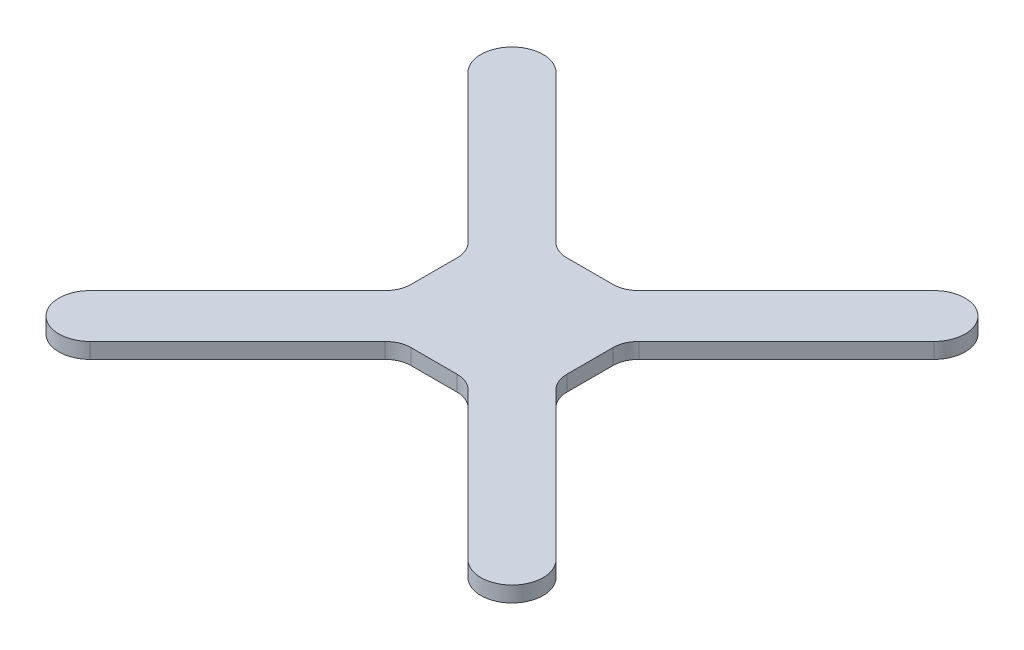
ISO-10303-21;
HEADER;
FILE_DESCRIPTION(('STEP AP214'),'2;1');
FILE_NAME('part.step','',(''),(''),'','','');
FILE_SCHEMA(('AUTOMOTIVE_DESIGN { 1 0 10303 214 1 1 1 1 }'));
ENDSEC;
DATA;
#1=APPLICATION_CONTEXT('core data for automotive mechanical design processes');
#2=APPLICATION_PROTOCOL_DEFINITION('international standard','automotive_design',2000,#1);
#3=PRODUCT_CONTEXT('',#1,'mechanical');
#4=PRODUCT('Part','Part','',(#3));
#5=PRODUCT_RELATED_PRODUCT_CATEGORY('part','',(#4));
#6=PRODUCT_DEFINITION_FORMATION('','',#4);
#7=PRODUCT_DEFINITION_CONTEXT('part definition',#1,'design');
#8=PRODUCT_DEFINITION('design','',#6,#7);
#9=PRODUCT_DEFINITION_SHAPE('','',#8);
#10=(LENGTH_UNIT() NAMED_UNIT(*) SI_UNIT(.MILLI.,.METRE.));
#11=(NAMED_UNIT(*) PLANE_ANGLE_UNIT() SI_UNIT($,.RADIAN.));
#12=(NAMED_UNIT(*) SI_UNIT($,.STERADIAN.) SOLID_ANGLE_UNIT());
#13=UNCERTAINTY_MEASURE_WITH_UNIT(LENGTH_MEASURE(1.E-05),#10,'distance_accuracy_value','');
#14=(GEOMETRIC_REPRESENTATION_CONTEXT(3) GLOBAL_UNCERTAINTY_ASSIGNED_CONTEXT((#13)) GLOBAL_UNIT_ASSIGNED_CONTEXT((#10,
#11,#12)) REPRESENTATION_CONTEXT('',''));
#15=CARTESIAN_POINT('',(0.,0.,0.));
#16=DIRECTION('',(0.,0.,1.));
#17=DIRECTION('',(1.,0.,0.));
#18=AXIS2_PLACEMENT_3D('',#15,#16,#17);
#19=CARTESIAN_POINT('',(-81.317279836453,6.,-81.317279836453));
#20=DIRECTION('',(0.,-1.,0.));
#21=DIRECTION('',(0.,0.,-1.));
#22=AXIS2_PLACEMENT_3D('',#19,#20,#21);
#23=CYLINDRICAL_SURFACE('',#22,12.0000000000002);
#24=CARTESIAN_POINT('',(-81.317279836453,0.,-81.317279836453));
#25=DIRECTION('',(0.,1.,0.));
#26=DIRECTION('',(0.,0.,1.));
#27=AXIS2_PLACEMENT_3D('',#24,#25,#26);
#28=CIRCLE('',#27,12.0000000000002);
#29=CARTESIAN_POINT('',(-72.8319984622141,0.,-89.8025612106918));
#30=VERTEX_POINT('',#29);
#31=CARTESIAN_POINT('',(-89.8025612106915,0.,-72.8319984622144));
#32=VERTEX_POINT('',#31);
#33=EDGE_CURVE('E231',#30,#32,#28,.T.);
#34=ORIENTED_EDGE('',*,*,#33,.T.);
#35=DIRECTION('',(0.,-1.,0.));
#36=VECTOR('',#35,1.);
#37=CARTESIAN_POINT('',(-89.8025612106915,6.,-72.8319984622144));
#38=LINE('',#37,#36);
#39=CARTESIAN_POINT('',(-89.8025612106915,6.,-72.8319984622144));
#40=VERTEX_POINT('',#39);
#41=EDGE_CURVE('E210',#40,#32,#38,.T.);
#42=ORIENTED_EDGE('',*,*,#41,.F.);
#43=CARTESIAN_POINT('',(-81.317279836453,6.,-81.317279836453));
#44=DIRECTION('',(0.,1.,0.));
#45=DIRECTION('',(0.,0.,1.));
#46=AXIS2_PLACEMENT_3D('',#43,#44,#45);
#47=CIRCLE('',#46,12.0000000000002);
#48=CARTESIAN_POINT('',(-72.8319984622141,6.,-89.8025612106918));
#49=VERTEX_POINT('',#48);
#50=EDGE_CURVE('E218',#49,#40,#47,.T.);
#51=ORIENTED_EDGE('',*,*,#50,.F.);
#52=DIRECTION('',(0.,-1.,0.));
#53=VECTOR('',#52,1.);
#54=CARTESIAN_POINT('',(-72.8319984622141,6.,-89.8025612106918));
#55=LINE('',#54,#53);
#56=EDGE_CURVE('E402',#49,#30,#55,.T.);
#57=ORIENTED_EDGE('',*,*,#56,.T.);
#58=EDGE_LOOP('',(#34,#42,#51,#57));
#59=FACE_BOUND('',#58,.T.);
#60=ADVANCED_FACE('F43',(#59),#23,.T.);
#61=CARTESIAN_POINT('',(-89.8025612106915,6.,-72.8319984622144));
#62=DIRECTION('',(0.707106781186549,0.,-0.707106781186546));
#63=DIRECTION('',(-0.707106781186546,0.,-0.707106781186549));
#64=AXIS2_PLACEMENT_3D('',#61,#62,#63);
#65=PLANE('',#64);
#66=DIRECTION('',(0.707106781186546,0.,0.707106781186549));
#67=VECTOR('',#66,1.);
#68=CARTESIAN_POINT('',(-89.8025612106915,0.,-72.8319984622144));
#69=LINE('',#68,#67);
#70=CARTESIAN_POINT('',(-32.928932188135,0.,-15.9583694396576));
#71=VERTEX_POINT('',#70);
#72=EDGE_CURVE('E436',#32,#71,#69,.T.);
#73=ORIENTED_EDGE('',*,*,#72,.T.);
#74=DIRECTION('',(0.,-1.,0.));
#75=VECTOR('',#74,1.);
#76=CARTESIAN_POINT('',(-32.928932188135,6.,-15.9583694396576));
#77=LINE('',#76,#75);
#78=CARTESIAN_POINT('',(-32.928932188135,6.,-15.9583694396576));
#79=VERTEX_POINT('',#78);
#80=EDGE_CURVE('E213',#71,#79,#77,.F.);
#81=ORIENTED_EDGE('',*,*,#80,.T.);
#82=DIRECTION('',(0.707106781186546,0.,0.707106781186549));
#83=VECTOR('',#82,1.);
#84=CARTESIAN_POINT('',(-89.8025612106915,6.,-72.8319984622144));
#85=LINE('',#84,#83);
#86=EDGE_CURVE('E205',#40,#79,#85,.T.);
#87=ORIENTED_EDGE('',*,*,#86,.F.);
#88=ORIENTED_EDGE('',*,*,#41,.T.);
#89=EDGE_LOOP('',(#73,#81,#87,#88));
#90=FACE_BOUND('',#89,.T.);
#91=ADVANCED_FACE('F208',(#90),#65,.F.);
#92=CARTESIAN_POINT('',(-30.0000000000005,6.,13.0294372515225));
#93=DIRECTION('',(1.,0.,0.));
#94=DIRECTION('',(0.,0.,-1.));
#95=AXIS2_PLACEMENT_3D('',#92,#93,#94);
#96=PLANE('',#95);
#97=DIRECTION('',(0.,0.,1.));
#98=VECTOR('',#97,1.);
#99=CARTESIAN_POINT('',(-30.0000000000005,6.,13.0294372515225));
#100=LINE('',#99,#98);
#101=CARTESIAN_POINT('',(-30.0000000000005,6.,-8.88730162779214));
#102=VERTEX_POINT('',#101);
#103=CARTESIAN_POINT('',(-30.0000000000005,6.,8.88730162779154));
#104=VERTEX_POINT('',#103);
#105=EDGE_CURVE('E217',#102,#104,#100,.T.);
#106=ORIENTED_EDGE('',*,*,#105,.F.);
#107=DIRECTION('',(0.,-1.,0.));
#108=VECTOR('',#107,1.);
#109=CARTESIAN_POINT('',(-30.0000000000005,0.,-8.88730162779215));
#110=LINE('',#109,#108);
#111=CARTESIAN_POINT('',(-30.0000000000005,0.,-8.88730162779214));
#112=VERTEX_POINT('',#111);
#113=EDGE_CURVE('E238',#102,#112,#110,.T.);
#114=ORIENTED_EDGE('',*,*,#113,.T.);
#115=DIRECTION('',(0.,0.,1.));
#116=VECTOR('',#115,1.);
#117=CARTESIAN_POINT('',(-30.0000000000005,0.,13.0294372515225));
#118=LINE('',#117,#116);
#119=CARTESIAN_POINT('',(-30.0000000000005,0.,8.88730162779154));
#120=VERTEX_POINT('',#119);
#121=EDGE_CURVE('E430',#112,#120,#118,.T.);
#122=ORIENTED_EDGE('',*,*,#121,.T.);
#123=DIRECTION('',(0.,-1.,0.));
#124=VECTOR('',#123,1.);
#125=CARTESIAN_POINT('',(-30.0000000000005,6.,8.88730162779154));
#126=LINE('',#125,#124);
#127=EDGE_CURVE('E233',#120,#104,#126,.F.);
#128=ORIENTED_EDGE('',*,*,#127,.T.);
#129=EDGE_LOOP('',(#106,#114,#122,#128));
#130=FACE_BOUND('',#129,.T.);
#131=ADVANCED_FACE('F500',(#130),#96,.F.);
#132=CARTESIAN_POINT('',(-30.0000000000005,6.,13.0294372515225));
#133=DIRECTION('',(0.707106781186553,0.,0.707106781186542));
#134=DIRECTION('',(0.707106781186542,0.,-0.707106781186553));
#135=AXIS2_PLACEMENT_3D('',#132,#133,#134);
#136=PLANE('',#135);
#137=DIRECTION('',(-0.707106781186542,0.,0.707106781186553));
#138=VECTOR('',#137,1.);
#139=CARTESIAN_POINT('',(-30.0000000000005,6.,13.0294372515225));
#140=LINE('',#139,#138);
#141=CARTESIAN_POINT('',(-32.9289321881349,6.,15.958369439657));
#142=VERTEX_POINT('',#141);
#143=CARTESIAN_POINT('',(-89.8025612106917,6.,72.8319984622141));
#144=VERTEX_POINT('',#143);
#145=EDGE_CURVE('E474',#142,#144,#140,.T.);
#146=ORIENTED_EDGE('',*,*,#145,.F.);
#147=DIRECTION('',(0.,-1.,0.));
#148=VECTOR('',#147,1.);
#149=CARTESIAN_POINT('',(-32.9289321881349,0.,15.958369439657));
#150=LINE('',#149,#148);
#151=CARTESIAN_POINT('',(-32.9289321881349,0.,15.958369439657));
#152=VERTEX_POINT('',#151);
#153=EDGE_CURVE('E250',#142,#152,#150,.T.);
#154=ORIENTED_EDGE('',*,*,#153,.T.);
#155=DIRECTION('',(-0.707106781186542,0.,0.707106781186553));
#156=VECTOR('',#155,1.);
#157=CARTESIAN_POINT('',(-30.0000000000005,0.,13.0294372515225));
#158=LINE('',#157,#156);
#159=CARTESIAN_POINT('',(-89.8025612106917,0.,72.8319984622141));
#160=VERTEX_POINT('',#159);
#161=EDGE_CURVE('E427',#152,#160,#158,.T.);
#162=ORIENTED_EDGE('',*,*,#161,.T.);
#163=DIRECTION('',(0.,-1.,0.));
#164=VECTOR('',#163,1.);
#165=CARTESIAN_POINT('',(-89.8025612106917,6.,72.8319984622141));
#166=LINE('',#165,#164);
#167=EDGE_CURVE('E234',#144,#160,#166,.T.);
#168=ORIENTED_EDGE('',*,*,#167,.F.);
#169=EDGE_LOOP('',(#146,#154,#162,#168));
#170=FACE_BOUND('',#169,.T.);
#171=ADVANCED_FACE('F489',(#170),#136,.F.);
#172=CARTESIAN_POINT('',(-81.317279836453,6.,81.3172798364529));
#173=DIRECTION('',(0.,-1.,0.));
#174=DIRECTION('',(0.,0.,-1.));
#175=AXIS2_PLACEMENT_3D('',#172,#173,#174);
#176=CYLINDRICAL_SURFACE('',#175,12.0000000000003);
#177=CARTESIAN_POINT('',(-81.317279836453,0.,81.3172798364529));
#178=DIRECTION('',(0.,1.,0.));
#179=DIRECTION('',(0.,0.,-1.));
#180=AXIS2_PLACEMENT_3D('',#177,#178,#179);
#181=CIRCLE('',#180,12.0000000000003);
#182=CARTESIAN_POINT('',(-72.8319984622139,0.,89.8025612106919));
#183=VERTEX_POINT('',#182);
#184=EDGE_CURVE('E372',#160,#183,#181,.T.);
#185=ORIENTED_EDGE('',*,*,#184,.T.);
#186=DIRECTION('',(0.,-1.,0.));
#187=VECTOR('',#186,1.);
#188=CARTESIAN_POINT('',(-72.8319984622139,6.,89.8025612106919));
#189=LINE('',#188,#187);
#190=CARTESIAN_POINT('',(-72.8319984622139,6.,89.8025612106919));
#191=VERTEX_POINT('',#190);
#192=EDGE_CURVE('E241',#191,#183,#189,.T.);
#193=ORIENTED_EDGE('',*,*,#192,.F.);
#194=CARTESIAN_POINT('',(-81.317279836453,6.,81.3172798364529));
#195=DIRECTION('',(0.,1.,0.));
#196=DIRECTION('',(0.,0.,-1.));
#197=AXIS2_PLACEMENT_3D('',#194,#195,#196);
#198=CIRCLE('',#197,12.0000000000003);
#199=EDGE_CURVE('E471',#144,#191,#198,.T.);
#200=ORIENTED_EDGE('',*,*,#199,.F.);
#201=ORIENTED_EDGE('',*,*,#167,.T.);
#202=EDGE_LOOP('',(#185,#193,#200,#201));
#203=FACE_BOUND('',#202,.T.);
#204=ADVANCED_FACE('F492',(#203),#176,.T.);
#205=CARTESIAN_POINT('',(-13.0294372515226,6.,30.0000000000006));
#206=DIRECTION('',(-0.707106781186547,0.,-0.707106781186548));
#207=DIRECTION('',(-0.707106781186548,0.,0.707106781186547));
#208=AXIS2_PLACEMENT_3D('',#205,#206,#207);
#209=PLANE('',#208);
#210=DIRECTION('',(0.707106781186548,0.,-0.707106781186547));
#211=VECTOR('',#210,1.);
#212=CARTESIAN_POINT('',(-13.0294372515226,0.,30.0000000000006));
#213=LINE('',#212,#211);
#214=CARTESIAN_POINT('',(-15.9583694396571,0.,32.9289321881351));
#215=VERTEX_POINT('',#214);
#216=EDGE_CURVE('E366',#183,#215,#213,.T.);
#217=ORIENTED_EDGE('',*,*,#216,.T.);
#218=DIRECTION('',(0.,-1.,0.));
#219=VECTOR('',#218,1.);
#220=CARTESIAN_POINT('',(-15.9583694396571,6.,32.9289321881351));
#221=LINE('',#220,#219);
#222=CARTESIAN_POINT('',(-15.9583694396571,6.,32.9289321881351));
#223=VERTEX_POINT('',#222);
#224=EDGE_CURVE('E59',#215,#223,#221,.F.);
#225=ORIENTED_EDGE('',*,*,#224,.T.);
#226=DIRECTION('',(0.707106781186548,0.,-0.707106781186547));
#227=VECTOR('',#226,1.);
#228=CARTESIAN_POINT('',(-13.0294372515226,6.,30.0000000000006));
#229=LINE('',#228,#227);
#230=EDGE_CURVE('E422',#191,#223,#229,.T.);
#231=ORIENTED_EDGE('',*,*,#230,.F.);
#232=ORIENTED_EDGE('',*,*,#192,.T.);
#233=EDGE_LOOP('',(#217,#225,#231,#232));
#234=FACE_BOUND('',#233,.T.);
#235=ADVANCED_FACE('F421',(#234),#209,.F.);
#236=CARTESIAN_POINT('',(-13.0294372515226,6.,30.0000000000006));
#237=DIRECTION('',(0.,0.,-1.));
#238=DIRECTION('',(-1.,0.,0.));
#239=AXIS2_PLACEMENT_3D('',#236,#237,#238);
#240=PLANE('',#239);
#241=DIRECTION('',(1.,0.,0.));
#242=VECTOR('',#241,1.);
#243=CARTESIAN_POINT('',(-13.0294372515226,0.,30.0000000000006));
#244=LINE('',#243,#242);
#245=CARTESIAN_POINT('',(-8.88730162779162,0.,30.0000000000006));
#246=VERTEX_POINT('',#245);
#247=CARTESIAN_POINT('',(8.88730162779206,0.,30.0000000000006));
#248=VERTEX_POINT('',#247);
#249=EDGE_CURVE('E359',#246,#248,#244,.T.);
#250=ORIENTED_EDGE('',*,*,#249,.T.);
#251=DIRECTION('',(0.,-1.,0.));
#252=VECTOR('',#251,1.);
#253=CARTESIAN_POINT('',(8.88730162779207,6.,30.0000000000006));
#254=LINE('',#253,#252);
#255=CARTESIAN_POINT('',(8.88730162779206,6.,30.0000000000006));
#256=VERTEX_POINT('',#255);
#257=EDGE_CURVE('E290',#248,#256,#254,.F.);
#258=ORIENTED_EDGE('',*,*,#257,.T.);
#259=DIRECTION('',(1.,0.,0.));
#260=VECTOR('',#259,1.);
#261=CARTESIAN_POINT('',(-13.0294372515226,6.,30.0000000000006));
#262=LINE('',#261,#260);
#263=CARTESIAN_POINT('',(-8.88730162779162,6.,30.0000000000006));
#264=VERTEX_POINT('',#263);
#265=EDGE_CURVE('E343',#264,#256,#262,.T.);
#266=ORIENTED_EDGE('',*,*,#265,.F.);
#267=DIRECTION('',(0.,-1.,0.));
#268=VECTOR('',#267,1.);
#269=CARTESIAN_POINT('',(-8.88730162779161,0.,30.0000000000006));
#270=LINE('',#269,#268);
#271=EDGE_CURVE('E286',#264,#246,#270,.T.);
#272=ORIENTED_EDGE('',*,*,#271,.T.);
#273=EDGE_LOOP('',(#250,#258,#266,#272));
#274=FACE_BOUND('',#273,.T.);
#275=ADVANCED_FACE('F363',(#274),#240,.F.);
#276=CARTESIAN_POINT('',(13.029437251523,6.,30.0000000000006));
#277=DIRECTION('',(0.707106781186545,0.,-0.70710678118655));
#278=DIRECTION('',(-0.70710678118655,0.,-0.707106781186545));
#279=AXIS2_PLACEMENT_3D('',#276,#277,#278);
#280=PLANE('',#279);
#281=DIRECTION('',(0.70710678118655,0.,0.707106781186545));
#282=VECTOR('',#281,1.);
#283=CARTESIAN_POINT('',(13.029437251523,6.,30.0000000000006));
#284=LINE('',#283,#282);
#285=CARTESIAN_POINT('',(15.9583694396575,6.,32.9289321881351));
#286=VERTEX_POINT('',#285);
#287=CARTESIAN_POINT('',(72.8319984622144,6.,89.8025612106915));
#288=VERTEX_POINT('',#287);
#289=EDGE_CURVE('E340',#286,#288,#284,.T.);
#290=ORIENTED_EDGE('',*,*,#289,.F.);
#291=DIRECTION('',(0.,-1.,0.));
#292=VECTOR('',#291,1.);
#293=CARTESIAN_POINT('',(15.9583694396575,0.,32.9289321881351));
#294=LINE('',#293,#292);
#295=CARTESIAN_POINT('',(15.9583694396575,0.,32.9289321881351));
#296=VERTEX_POINT('',#295);
#297=EDGE_CURVE('E282',#286,#296,#294,.T.);
#298=ORIENTED_EDGE('',*,*,#297,.T.);
#299=DIRECTION('',(0.70710678118655,0.,0.707106781186545));
#300=VECTOR('',#299,1.);
#301=CARTESIAN_POINT('',(13.029437251523,0.,30.0000000000006));
#302=LINE('',#301,#300);
#303=CARTESIAN_POINT('',(72.8319984622144,0.,89.8025612106915));
#304=VERTEX_POINT('',#303);
#305=EDGE_CURVE('E361',#296,#304,#302,.T.);
#306=ORIENTED_EDGE('',*,*,#305,.T.);
#307=DIRECTION('',(0.,-1.,0.));
#308=VECTOR('',#307,1.);
#309=CARTESIAN_POINT('',(72.8319984622144,6.,89.8025612106915));
#310=LINE('',#309,#308);
#311=EDGE_CURVE('E351',#288,#304,#310,.T.);
#312=ORIENTED_EDGE('',*,*,#311,.F.);
#313=EDGE_LOOP('',(#290,#298,#306,#312));
#314=FACE_BOUND('',#313,.T.);
#315=ADVANCED_FACE('F348',(#314),#280,.F.);
#316=CARTESIAN_POINT('',(81.317279836453,6.,81.317279836453));
#317=DIRECTION('',(0.,-1.,0.));
#318=DIRECTION('',(0.,0.,-1.));
#319=AXIS2_PLACEMENT_3D('',#316,#317,#318);
#320=CYLINDRICAL_SURFACE('',#319,12.);
#321=CARTESIAN_POINT('',(81.317279836453,0.,81.317279836453));
#322=DIRECTION('',(0.,1.,0.));
#323=DIRECTION('',(0.,0.,1.));
#324=AXIS2_PLACEMENT_3D('',#321,#322,#323);
#325=CIRCLE('',#324,12.);
#326=CARTESIAN_POINT('',(89.8025612106915,0.,72.8319984622145));
#327=VERTEX_POINT('',#326);
#328=EDGE_CURVE('E370',#304,#327,#325,.T.);
#329=ORIENTED_EDGE('',*,*,#328,.T.);
#330=DIRECTION('',(0.,-1.,0.));
#331=VECTOR('',#330,1.);
#332=CARTESIAN_POINT('',(89.8025612106915,6.,72.8319984622145));
#333=LINE('',#332,#331);
#334=CARTESIAN_POINT('',(89.8025612106915,6.,72.8319984622145));
#335=VERTEX_POINT('',#334);
#336=EDGE_CURVE('E413',#335,#327,#333,.T.);
#337=ORIENTED_EDGE('',*,*,#336,.F.);
#338=CARTESIAN_POINT('',(81.317279836453,6.,81.317279836453));
#339=DIRECTION('',(0.,1.,0.));
#340=DIRECTION('',(0.,0.,1.));
#341=AXIS2_PLACEMENT_3D('',#338,#339,#340);
#342=CIRCLE('',#341,12.);
#343=EDGE_CURVE('E354',#288,#335,#342,.T.);
#344=ORIENTED_EDGE('',*,*,#343,.F.);
#345=ORIENTED_EDGE('',*,*,#311,.T.);
#346=EDGE_LOOP('',(#329,#337,#344,#345));
#347=FACE_BOUND('',#346,.T.);
#348=ADVANCED_FACE('F672',(#347),#320,.T.);
#349=CARTESIAN_POINT('',(30.,6.,13.0294372515225));
#350=DIRECTION('',(-0.70710678118655,0.,0.707106781186544));
#351=DIRECTION('',(0.707106781186545,0.,0.707106781186551));
#352=AXIS2_PLACEMENT_3D('',#349,#350,#351);
#353=PLANE('',#352);
#354=DIRECTION('',(-0.707106781186544,0.,-0.707106781186551));
#355=VECTOR('',#354,1.);
#356=CARTESIAN_POINT('',(30.,0.,13.0294372515225));
#357=LINE('',#356,#355);
#358=CARTESIAN_POINT('',(32.9289321881345,0.,15.958369439657));
#359=VERTEX_POINT('',#358);
#360=EDGE_CURVE('E378',#327,#359,#357,.T.);
#361=ORIENTED_EDGE('',*,*,#360,.T.);
#362=DIRECTION('',(0.,-1.,0.));
#363=VECTOR('',#362,1.);
#364=CARTESIAN_POINT('',(32.9289321881345,6.,15.958369439657));
#365=LINE('',#364,#363);
#366=CARTESIAN_POINT('',(32.9289321881345,6.,15.958369439657));
#367=VERTEX_POINT('',#366);
#368=EDGE_CURVE('E275',#359,#367,#365,.F.);
#369=ORIENTED_EDGE('',*,*,#368,.T.);
#370=DIRECTION('',(-0.707106781186544,0.,-0.707106781186551));
#371=VECTOR('',#370,1.);
#372=CARTESIAN_POINT('',(30.,6.,13.0294372515225));
#373=LINE('',#372,#371);
#374=EDGE_CURVE('E461',#335,#367,#373,.T.);
#375=ORIENTED_EDGE('',*,*,#374,.F.);
#376=ORIENTED_EDGE('',*,*,#336,.T.);
#377=EDGE_LOOP('',(#361,#369,#375,#376));
#378=FACE_BOUND('',#377,.T.);
#379=ADVANCED_FACE('F661',(#378),#353,.F.);
#380=CARTESIAN_POINT('',(30.,6.,13.0294372515225));
#381=DIRECTION('',(-1.,0.,0.));
#382=DIRECTION('',(0.,0.,1.));
#383=AXIS2_PLACEMENT_3D('',#380,#381,#382);
#384=PLANE('',#383);
#385=DIRECTION('',(0.,0.,-1.));
#386=VECTOR('',#385,1.);
#387=CARTESIAN_POINT('',(30.,6.,13.0294372515225));
#388=LINE('',#387,#386);
#389=CARTESIAN_POINT('',(30.,6.,8.88730162779153));
#390=VERTEX_POINT('',#389);
#391=CARTESIAN_POINT('',(30.0000000000001,6.,-8.88730162779218));
#392=VERTEX_POINT('',#391);
#393=EDGE_CURVE('E457',#390,#392,#388,.T.);
#394=ORIENTED_EDGE('',*,*,#393,.F.);
#395=DIRECTION('',(0.,-1.,0.));
#396=VECTOR('',#395,1.);
#397=CARTESIAN_POINT('',(30.,0.,8.88730162779153));
#398=LINE('',#397,#396);
#399=CARTESIAN_POINT('',(30.,0.,8.88730162779153));
#400=VERTEX_POINT('',#399);
#401=EDGE_CURVE('E271',#390,#400,#398,.T.);
#402=ORIENTED_EDGE('',*,*,#401,.T.);
#403=DIRECTION('',(0.,0.,-1.));
#404=VECTOR('',#403,1.);
#405=CARTESIAN_POINT('',(30.,0.,13.0294372515225));
#406=LINE('',#405,#404);
#407=CARTESIAN_POINT('',(30.0000000000001,0.,-8.88730162779218));
#408=VERTEX_POINT('',#407);
#409=EDGE_CURVE('E382',#400,#408,#406,.T.);
#410=ORIENTED_EDGE('',*,*,#409,.T.);
#411=DIRECTION('',(0.,-1.,0.));
#412=VECTOR('',#411,1.);
#413=CARTESIAN_POINT('',(30.0000000000001,6.,-8.88730162779218));
#414=LINE('',#413,#412);
#415=EDGE_CURVE('E268',#408,#392,#414,.F.);
#416=ORIENTED_EDGE('',*,*,#415,.T.);
#417=EDGE_LOOP('',(#394,#402,#410,#416));
#418=FACE_BOUND('',#417,.T.);
#419=ADVANCED_FACE('F650',(#418),#384,.F.);
#420=CARTESIAN_POINT('',(89.8025612106914,6.,-72.8319984622146));
#421=DIRECTION('',(-0.707106781186548,0.,-0.707106781186546));
#422=DIRECTION('',(-0.707106781186546,0.,0.707106781186549));
#423=AXIS2_PLACEMENT_3D('',#420,#421,#422);
#424=PLANE('',#423);
#425=DIRECTION('',(0.707106781186546,0.,-0.707106781186549));
#426=VECTOR('',#425,1.);
#427=CARTESIAN_POINT('',(89.8025612106914,6.,-72.8319984622146));
#428=LINE('',#427,#426);
#429=CARTESIAN_POINT('',(32.9289321881346,6.,-15.9583694396576));
#430=VERTEX_POINT('',#429);
#431=CARTESIAN_POINT('',(89.8025612106918,6.,-72.8319984622142));
#432=VERTEX_POINT('',#431);
#433=EDGE_CURVE('E454',#430,#432,#428,.T.);
#434=ORIENTED_EDGE('',*,*,#433,.F.);
#435=DIRECTION('',(0.,-1.,0.));
#436=VECTOR('',#435,1.);
#437=CARTESIAN_POINT('',(32.9289321881346,0.,-15.9583694396576));
#438=LINE('',#437,#436);
#439=CARTESIAN_POINT('',(32.9289321881346,0.,-15.9583694396576));
#440=VERTEX_POINT('',#439);
#441=EDGE_CURVE('E278',#430,#440,#438,.T.);
#442=ORIENTED_EDGE('',*,*,#441,.T.);
#443=DIRECTION('',(0.707106781186546,0.,-0.707106781186549));
#444=VECTOR('',#443,1.);
#445=CARTESIAN_POINT('',(89.8025612106914,0.,-72.8319984622146));
#446=LINE('',#445,#444);
#447=CARTESIAN_POINT('',(89.8025612106918,0.,-72.8319984622142));
#448=VERTEX_POINT('',#447);
#449=EDGE_CURVE('E386',#440,#448,#446,.T.);
#450=ORIENTED_EDGE('',*,*,#449,.T.);
#451=DIRECTION('',(0.,-1.,0.));
#452=VECTOR('',#451,1.);
#453=CARTESIAN_POINT('',(89.8025612106918,6.,-72.8319984622142));
#454=LINE('',#453,#452);
#455=EDGE_CURVE('E409',#432,#448,#454,.T.);
#456=ORIENTED_EDGE('',*,*,#455,.F.);
#457=EDGE_LOOP('',(#434,#442,#450,#456));
#458=FACE_BOUND('',#457,.T.);
#459=ADVANCED_FACE('F645',(#458),#424,.F.);
#460=CARTESIAN_POINT('',(81.317279836453,6.,-81.317279836453));
#461=DIRECTION('',(0.,-1.,0.));
#462=DIRECTION('',(0.,0.,-1.));
#463=AXIS2_PLACEMENT_3D('',#460,#461,#462);
#464=CYLINDRICAL_SURFACE('',#463,12.0000000000003);
#465=CARTESIAN_POINT('',(81.317279836453,0.,-81.317279836453));
#466=DIRECTION('',(0.,1.,0.));
#467=DIRECTION('',(0.,0.,-1.));
#468=AXIS2_PLACEMENT_3D('',#465,#466,#467);
#469=CIRCLE('',#468,12.0000000000003);
#470=CARTESIAN_POINT('',(72.8319984622138,0.,-89.8025612106921));
#471=VERTEX_POINT('',#470);
#472=EDGE_CURVE('E389',#448,#471,#469,.T.);
#473=ORIENTED_EDGE('',*,*,#472,.T.);
#474=DIRECTION('',(0.,-1.,0.));
#475=VECTOR('',#474,1.);
#476=CARTESIAN_POINT('',(72.8319984622138,6.,-89.8025612106921));
#477=LINE('',#476,#475);
#478=CARTESIAN_POINT('',(72.8319984622138,6.,-89.8025612106921));
#479=VERTEX_POINT('',#478);
#480=EDGE_CURVE('E405',#479,#471,#477,.T.);
#481=ORIENTED_EDGE('',*,*,#480,.F.);
#482=CARTESIAN_POINT('',(81.317279836453,6.,-81.317279836453));
#483=DIRECTION('',(0.,1.,0.));
#484=DIRECTION('',(0.,0.,-1.));
#485=AXIS2_PLACEMENT_3D('',#482,#483,#484);
#486=CIRCLE('',#485,12.0000000000003);
#487=EDGE_CURVE('E451',#432,#479,#486,.T.);
#488=ORIENTED_EDGE('',*,*,#487,.F.);
#489=ORIENTED_EDGE('',*,*,#455,.T.);
#490=EDGE_LOOP('',(#473,#481,#488,#489));
#491=FACE_BOUND('',#490,.T.);
#492=ADVANCED_FACE('F636',(#491),#464,.T.);
#493=CARTESIAN_POINT('',(72.8319984622138,6.,-89.8025612106921));
#494=DIRECTION('',(0.707106781186548,0.,0.707106781186547));
#495=DIRECTION('',(0.707106781186547,0.,-0.707106781186548));
#496=AXIS2_PLACEMENT_3D('',#493,#494,#495);
#497=PLANE('',#496);
#498=DIRECTION('',(-0.707106781186547,0.,0.707106781186548));
#499=VECTOR('',#498,1.);
#500=CARTESIAN_POINT('',(72.8319984622138,0.,-89.8025612106921));
#501=LINE('',#500,#499);
#502=CARTESIAN_POINT('',(15.958369439657,0.,-32.9289321881352));
#503=VERTEX_POINT('',#502);
#504=EDGE_CURVE('E392',#471,#503,#501,.T.);
#505=ORIENTED_EDGE('',*,*,#504,.T.);
#506=DIRECTION('',(0.,-1.,0.));
#507=VECTOR('',#506,1.);
#508=CARTESIAN_POINT('',(15.9583694396569,6.,-32.9289321881352));
#509=LINE('',#508,#507);
#510=CARTESIAN_POINT('',(15.958369439657,6.,-32.9289321881352));
#511=VERTEX_POINT('',#510);
#512=EDGE_CURVE('E265',#503,#511,#509,.F.);
#513=ORIENTED_EDGE('',*,*,#512,.T.);
#514=DIRECTION('',(-0.707106781186547,0.,0.707106781186548));
#515=VECTOR('',#514,1.);
#516=CARTESIAN_POINT('',(72.8319984622138,6.,-89.8025612106921));
#517=LINE('',#516,#515);
#518=EDGE_CURVE('E447',#479,#511,#517,.T.);
#519=ORIENTED_EDGE('',*,*,#518,.F.);
#520=ORIENTED_EDGE('',*,*,#480,.T.);
#521=EDGE_LOOP('',(#505,#513,#519,#520));
#522=FACE_BOUND('',#521,.T.);
#523=ADVANCED_FACE('F625',(#522),#497,.F.);
#524=CARTESIAN_POINT('',(-13.0294372515223,6.,-30.0000000000001));
#525=DIRECTION('',(0.,0.,1.));
#526=DIRECTION('',(1.,0.,0.));
#527=AXIS2_PLACEMENT_3D('',#524,#525,#526);
#528=PLANE('',#527);
#529=DIRECTION('',(-1.,0.,0.));
#530=VECTOR('',#529,1.);
#531=CARTESIAN_POINT('',(-13.0294372515223,0.,-30.0000000000001));
#532=LINE('',#531,#530);
#533=CARTESIAN_POINT('',(8.88730162779173,0.,-30.0000000000007));
#534=VERTEX_POINT('',#533);
#535=CARTESIAN_POINT('',(-8.88730162779122,0.,-30.0000000000002));
#536=VERTEX_POINT('',#535);
#537=EDGE_CURVE('E396',#534,#536,#532,.T.);
#538=ORIENTED_EDGE('',*,*,#537,.T.);
#539=DIRECTION('',(0.,-1.,0.));
#540=VECTOR('',#539,1.);
#541=CARTESIAN_POINT('',(-8.88730162779122,6.,-30.0000000000002));
#542=LINE('',#541,#540);
#543=CARTESIAN_POINT('',(-8.88730162779122,6.,-30.0000000000002));
#544=VERTEX_POINT('',#543);
#545=EDGE_CURVE('E262',#536,#544,#542,.F.);
#546=ORIENTED_EDGE('',*,*,#545,.T.);
#547=DIRECTION('',(-1.,0.,0.));
#548=VECTOR('',#547,1.);
#549=CARTESIAN_POINT('',(-13.0294372515223,6.,-30.0000000000001));
#550=LINE('',#549,#548);
#551=CARTESIAN_POINT('',(8.88730162779173,6.,-30.0000000000007));
#552=VERTEX_POINT('',#551);
#553=EDGE_CURVE('E443',#552,#544,#550,.T.);
#554=ORIENTED_EDGE('',*,*,#553,.F.);
#555=DIRECTION('',(0.,-1.,0.));
#556=VECTOR('',#555,1.);
#557=CARTESIAN_POINT('',(8.88730162779173,0.,-30.0000000000007));
#558=LINE('',#557,#556);
#559=EDGE_CURVE('E258',#552,#534,#558,.T.);
#560=ORIENTED_EDGE('',*,*,#559,.T.);
#561=EDGE_LOOP('',(#538,#546,#554,#560));
#562=FACE_BOUND('',#561,.T.);
#563=ADVANCED_FACE('F614',(#562),#528,.F.);
#564=CARTESIAN_POINT('',(-72.8319984622141,6.,-89.8025612106918));
#565=DIRECTION('',(-0.707106781186547,0.,0.707106781186548));
#566=DIRECTION('',(0.707106781186548,0.,0.707106781186547));
#567=AXIS2_PLACEMENT_3D('',#564,#565,#566);
#568=PLANE('',#567);
#569=DIRECTION('',(-0.707106781186548,0.,-0.707106781186547));
#570=VECTOR('',#569,1.);
#571=CARTESIAN_POINT('',(-72.8319984622141,6.,-89.8025612106918));
#572=LINE('',#571,#570);
#573=CARTESIAN_POINT('',(-15.958369439657,6.,-32.9289321881348));
#574=VERTEX_POINT('',#573);
#575=EDGE_CURVE('E223',#574,#49,#572,.T.);
#576=ORIENTED_EDGE('',*,*,#575,.F.);
#577=DIRECTION('',(0.,-1.,0.));
#578=VECTOR('',#577,1.);
#579=CARTESIAN_POINT('',(-15.958369439657,0.,-32.9289321881347));
#580=LINE('',#579,#578);
#581=CARTESIAN_POINT('',(-15.958369439657,0.,-32.9289321881348));
#582=VERTEX_POINT('',#581);
#583=EDGE_CURVE('E254',#574,#582,#580,.T.);
#584=ORIENTED_EDGE('',*,*,#583,.T.);
#585=DIRECTION('',(-0.707106781186548,0.,-0.707106781186547));
#586=VECTOR('',#585,1.);
#587=CARTESIAN_POINT('',(-72.8319984622141,0.,-89.8025612106918));
#588=LINE('',#587,#586);
#589=EDGE_CURVE('E228',#582,#30,#588,.T.);
#590=ORIENTED_EDGE('',*,*,#589,.T.);
#591=ORIENTED_EDGE('',*,*,#56,.F.);
#592=EDGE_LOOP('',(#576,#584,#590,#591));
#593=FACE_BOUND('',#592,.T.);
#594=ADVANCED_FACE('F604',(#593),#568,.F.);
#595=CARTESIAN_POINT('',(-81.317279836453,6.,-81.317279836453));
#596=DIRECTION('',(0.,1.,0.));
#597=DIRECTION('',(0.,0.,1.));
#598=AXIS2_PLACEMENT_3D('',#595,#596,#597);
#599=PLANE('',#598);
#600=ORIENTED_EDGE('',*,*,#50,.T.);
#601=ORIENTED_EDGE('',*,*,#86,.T.);
#602=CARTESIAN_POINT('',(-40.0000000000005,6.,-8.88730162779215));
#603=DIRECTION('',(0.,1.,0.));
#604=DIRECTION('',(0.,0.,1.));
#605=AXIS2_PLACEMENT_3D('',#602,#603,#604);
#606=CIRCLE('',#605,10.);
#607=EDGE_CURVE('E298',#79,#102,#606,.F.);
#608=ORIENTED_EDGE('',*,*,#607,.T.);
#609=ORIENTED_EDGE('',*,*,#105,.T.);
#610=CARTESIAN_POINT('',(-40.0000000000005,6.,8.88730162779154));
#611=DIRECTION('',(0.,1.,0.));
#612=DIRECTION('',(0.,0.,1.));
#613=AXIS2_PLACEMENT_3D('',#610,#611,#612);
#614=CIRCLE('',#613,10.);
#615=EDGE_CURVE('E304',#104,#142,#614,.F.);
#616=ORIENTED_EDGE('',*,*,#615,.T.);
#617=ORIENTED_EDGE('',*,*,#145,.T.);
#618=ORIENTED_EDGE('',*,*,#199,.T.);
#619=ORIENTED_EDGE('',*,*,#230,.T.);
#620=CARTESIAN_POINT('',(-8.88730162779161,6.,40.0000000000006));
#621=DIRECTION('',(0.,1.,0.));
#622=DIRECTION('',(0.,0.,1.));
#623=AXIS2_PLACEMENT_3D('',#620,#621,#622);
#624=CIRCLE('',#623,10.);
#625=EDGE_CURVE('E11',#223,#264,#624,.F.);
#626=ORIENTED_EDGE('',*,*,#625,.T.);
#627=ORIENTED_EDGE('',*,*,#265,.T.);
#628=CARTESIAN_POINT('',(8.88730162779207,6.,40.0000000000006));
#629=DIRECTION('',(0.,1.,0.));
#630=DIRECTION('',(0.,0.,1.));
#631=AXIS2_PLACEMENT_3D('',#628,#629,#630);
#632=CIRCLE('',#631,10.);
#633=EDGE_CURVE('E334',#256,#286,#632,.F.);
#634=ORIENTED_EDGE('',*,*,#633,.T.);
#635=ORIENTED_EDGE('',*,*,#289,.T.);
#636=ORIENTED_EDGE('',*,*,#343,.T.);
#637=ORIENTED_EDGE('',*,*,#374,.T.);
#638=CARTESIAN_POINT('',(40.,6.,8.88730162779154));
#639=DIRECTION('',(0.,1.,0.));
#640=DIRECTION('',(0.,0.,1.));
#641=AXIS2_PLACEMENT_3D('',#638,#639,#640);
#642=CIRCLE('',#641,10.);
#643=EDGE_CURVE('E322',#367,#390,#642,.F.);
#644=ORIENTED_EDGE('',*,*,#643,.T.);
#645=ORIENTED_EDGE('',*,*,#393,.T.);
#646=CARTESIAN_POINT('',(40.0000000000001,6.,-8.88730162779217));
#647=DIRECTION('',(0.,1.,0.));
#648=DIRECTION('',(0.,0.,1.));
#649=AXIS2_PLACEMENT_3D('',#646,#647,#648);
#650=CIRCLE('',#649,10.);
#651=EDGE_CURVE('E328',#392,#430,#650,.F.);
#652=ORIENTED_EDGE('',*,*,#651,.T.);
#653=ORIENTED_EDGE('',*,*,#433,.T.);
#654=ORIENTED_EDGE('',*,*,#487,.T.);
#655=ORIENTED_EDGE('',*,*,#518,.T.);
#656=CARTESIAN_POINT('',(8.88730162779146,6.,-40.0000000000007));
#657=DIRECTION('',(0.,1.,0.));
#658=DIRECTION('',(0.,0.,1.));
#659=AXIS2_PLACEMENT_3D('',#656,#657,#658);
#660=CIRCLE('',#659,10.);
#661=EDGE_CURVE('E316',#511,#552,#660,.F.);
#662=ORIENTED_EDGE('',*,*,#661,.T.);
#663=ORIENTED_EDGE('',*,*,#553,.T.);
#664=CARTESIAN_POINT('',(-8.88730162779148,6.,-40.0000000000002));
#665=DIRECTION('',(0.,1.,0.));
#666=DIRECTION('',(0.,0.,1.));
#667=AXIS2_PLACEMENT_3D('',#664,#665,#666);
#668=CIRCLE('',#667,10.);
#669=EDGE_CURVE('E310',#544,#574,#668,.F.);
#670=ORIENTED_EDGE('',*,*,#669,.T.);
#671=ORIENTED_EDGE('',*,*,#575,.T.);
#672=EDGE_LOOP('',(#600,#601,#608,#609,#616,#617,#618,#619,#626,#627,#634,#635,#636,#637,#644,
#645,#652,#653,#654,#655,#662,#663,#670,#671));
#673=FACE_BOUND('',#672,.T.);
#674=ADVANCED_FACE('F221',(#673),#599,.T.);
#675=CARTESIAN_POINT('',(-81.317279836453,0.,-81.317279836453));
#676=DIRECTION('',(0.,1.,0.));
#677=DIRECTION('',(0.,0.,1.));
#678=AXIS2_PLACEMENT_3D('',#675,#676,#677);
#679=PLANE('',#678);
#680=ORIENTED_EDGE('',*,*,#33,.F.);
#681=ORIENTED_EDGE('',*,*,#589,.F.);
#682=CARTESIAN_POINT('',(-8.88730162779148,0.,-40.0000000000002));
#683=DIRECTION('',(0.,1.,0.));
#684=DIRECTION('',(0.,0.,1.));
#685=AXIS2_PLACEMENT_3D('',#682,#683,#684);
#686=CIRCLE('',#685,10.);
#687=EDGE_CURVE('E307',#582,#536,#686,.T.);
#688=ORIENTED_EDGE('',*,*,#687,.T.);
#689=ORIENTED_EDGE('',*,*,#537,.F.);
#690=CARTESIAN_POINT('',(8.88730162779146,0.,-40.0000000000007));
#691=DIRECTION('',(0.,1.,0.));
#692=DIRECTION('',(0.,0.,1.));
#693=AXIS2_PLACEMENT_3D('',#690,#691,#692);
#694=CIRCLE('',#693,10.);
#695=EDGE_CURVE('E313',#534,#503,#694,.T.);
#696=ORIENTED_EDGE('',*,*,#695,.T.);
#697=ORIENTED_EDGE('',*,*,#504,.F.);
#698=ORIENTED_EDGE('',*,*,#472,.F.);
#699=ORIENTED_EDGE('',*,*,#449,.F.);
#700=CARTESIAN_POINT('',(40.0000000000001,0.,-8.88730162779217));
#701=DIRECTION('',(0.,1.,0.));
#702=DIRECTION('',(0.,0.,1.));
#703=AXIS2_PLACEMENT_3D('',#700,#701,#702);
#704=CIRCLE('',#703,10.);
#705=EDGE_CURVE('E325',#440,#408,#704,.T.);
#706=ORIENTED_EDGE('',*,*,#705,.T.);
#707=ORIENTED_EDGE('',*,*,#409,.F.);
#708=CARTESIAN_POINT('',(40.,0.,8.88730162779154));
#709=DIRECTION('',(0.,1.,0.));
#710=DIRECTION('',(0.,0.,1.));
#711=AXIS2_PLACEMENT_3D('',#708,#709,#710);
#712=CIRCLE('',#711,10.);
#713=EDGE_CURVE('E319',#400,#359,#712,.T.);
#714=ORIENTED_EDGE('',*,*,#713,.T.);
#715=ORIENTED_EDGE('',*,*,#360,.F.);
#716=ORIENTED_EDGE('',*,*,#328,.F.);
#717=ORIENTED_EDGE('',*,*,#305,.F.);
#718=CARTESIAN_POINT('',(8.88730162779207,0.,40.0000000000006));
#719=DIRECTION('',(0.,1.,0.));
#720=DIRECTION('',(0.,0.,1.));
#721=AXIS2_PLACEMENT_3D('',#718,#719,#720);
#722=CIRCLE('',#721,10.);
#723=EDGE_CURVE('E331',#296,#248,#722,.T.);
#724=ORIENTED_EDGE('',*,*,#723,.T.);
#725=ORIENTED_EDGE('',*,*,#249,.F.);
#726=CARTESIAN_POINT('',(-8.88730162779161,0.,40.0000000000006));
#727=DIRECTION('',(0.,1.,0.));
#728=DIRECTION('',(0.,0.,1.));
#729=AXIS2_PLACEMENT_3D('',#726,#727,#728);
#730=CIRCLE('',#729,10.);
#731=EDGE_CURVE('E52',#246,#215,#730,.T.);
#732=ORIENTED_EDGE('',*,*,#731,.T.);
#733=ORIENTED_EDGE('',*,*,#216,.F.);
#734=ORIENTED_EDGE('',*,*,#184,.F.);
#735=ORIENTED_EDGE('',*,*,#161,.F.);
#736=CARTESIAN_POINT('',(-40.0000000000005,0.,8.88730162779154));
#737=DIRECTION('',(0.,1.,0.));
#738=DIRECTION('',(0.,0.,1.));
#739=AXIS2_PLACEMENT_3D('',#736,#737,#738);
#740=CIRCLE('',#739,10.);
#741=EDGE_CURVE('E301',#152,#120,#740,.T.);
#742=ORIENTED_EDGE('',*,*,#741,.T.);
#743=ORIENTED_EDGE('',*,*,#121,.F.);
#744=CARTESIAN_POINT('',(-40.0000000000005,0.,-8.88730162779215));
#745=DIRECTION('',(0.,1.,0.));
#746=DIRECTION('',(0.,0.,1.));
#747=AXIS2_PLACEMENT_3D('',#744,#745,#746);
#748=CIRCLE('',#747,10.);
#749=EDGE_CURVE('E295',#112,#71,#748,.T.);
#750=ORIENTED_EDGE('',*,*,#749,.T.);
#751=ORIENTED_EDGE('',*,*,#72,.F.);
#752=EDGE_LOOP('',(#680,#681,#688,#689,#696,#697,#698,#699,#706,#707,#714,#715,#716,#717,#724,
#725,#732,#733,#734,#735,#742,#743,#750,#751));
#753=FACE_BOUND('',#752,.T.);
#754=ADVANCED_FACE('F358',(#753),#679,.F.);
#755=CARTESIAN_POINT('',(-40.0000000000005,6.,-8.88730162779215));
#756=DIRECTION('',(0.,1.,0.));
#757=DIRECTION('',(0.,0.,1.));
#758=AXIS2_PLACEMENT_3D('',#755,#756,#757);
#759=CYLINDRICAL_SURFACE('',#758,10.);
#760=ORIENTED_EDGE('',*,*,#607,.F.);
#761=ORIENTED_EDGE('',*,*,#80,.F.);
#762=ORIENTED_EDGE('',*,*,#749,.F.);
#763=ORIENTED_EDGE('',*,*,#113,.F.);
#764=EDGE_LOOP('',(#760,#761,#762,#763));
#765=FACE_BOUND('',#764,.T.);
#766=ADVANCED_FACE('F510',(#765),#759,.F.);
#767=CARTESIAN_POINT('',(-40.0000000000005,6.,8.88730162779154));
#768=DIRECTION('',(0.,1.,0.));
#769=DIRECTION('',(0.,0.,1.));
#770=AXIS2_PLACEMENT_3D('',#767,#768,#769);
#771=CYLINDRICAL_SURFACE('',#770,10.);
#772=ORIENTED_EDGE('',*,*,#615,.F.);
#773=ORIENTED_EDGE('',*,*,#127,.F.);
#774=ORIENTED_EDGE('',*,*,#741,.F.);
#775=ORIENTED_EDGE('',*,*,#153,.F.);
#776=EDGE_LOOP('',(#772,#773,#774,#775));
#777=FACE_BOUND('',#776,.T.);
#778=ADVANCED_FACE('F487',(#777),#771,.F.);
#779=CARTESIAN_POINT('',(-8.88730162779148,6.,-40.0000000000002));
#780=DIRECTION('',(0.,1.,0.));
#781=DIRECTION('',(0.,0.,1.));
#782=AXIS2_PLACEMENT_3D('',#779,#780,#781);
#783=CYLINDRICAL_SURFACE('',#782,10.);
#784=ORIENTED_EDGE('',*,*,#669,.F.);
#785=ORIENTED_EDGE('',*,*,#545,.F.);
#786=ORIENTED_EDGE('',*,*,#687,.F.);
#787=ORIENTED_EDGE('',*,*,#583,.F.);
#788=EDGE_LOOP('',(#784,#785,#786,#787));
#789=FACE_BOUND('',#788,.T.);
#790=ADVANCED_FACE('F516',(#789),#783,.F.);
#791=CARTESIAN_POINT('',(8.88730162779146,6.,-40.0000000000007));
#792=DIRECTION('',(0.,1.,0.));
#793=DIRECTION('',(0.,0.,1.));
#794=AXIS2_PLACEMENT_3D('',#791,#792,#793);
#795=CYLINDRICAL_SURFACE('',#794,10.);
#796=ORIENTED_EDGE('',*,*,#661,.F.);
#797=ORIENTED_EDGE('',*,*,#512,.F.);
#798=ORIENTED_EDGE('',*,*,#695,.F.);
#799=ORIENTED_EDGE('',*,*,#559,.F.);
#800=EDGE_LOOP('',(#796,#797,#798,#799));
#801=FACE_BOUND('',#800,.T.);
#802=ADVANCED_FACE('F519',(#801),#795,.F.);
#803=CARTESIAN_POINT('',(40.,6.,8.88730162779154));
#804=DIRECTION('',(0.,1.,0.));
#805=DIRECTION('',(0.,0.,1.));
#806=AXIS2_PLACEMENT_3D('',#803,#804,#805);
#807=CYLINDRICAL_SURFACE('',#806,10.);
#808=ORIENTED_EDGE('',*,*,#643,.F.);
#809=ORIENTED_EDGE('',*,*,#368,.F.);
#810=ORIENTED_EDGE('',*,*,#713,.F.);
#811=ORIENTED_EDGE('',*,*,#401,.F.);
#812=EDGE_LOOP('',(#808,#809,#810,#811));
#813=FACE_BOUND('',#812,.T.);
#814=ADVANCED_FACE('F523',(#813),#807,.F.);
#815=CARTESIAN_POINT('',(40.0000000000001,6.,-8.88730162779217));
#816=DIRECTION('',(0.,1.,0.));
#817=DIRECTION('',(0.,0.,1.));
#818=AXIS2_PLACEMENT_3D('',#815,#816,#817);
#819=CYLINDRICAL_SURFACE('',#818,10.);
#820=ORIENTED_EDGE('',*,*,#651,.F.);
#821=ORIENTED_EDGE('',*,*,#415,.F.);
#822=ORIENTED_EDGE('',*,*,#705,.F.);
#823=ORIENTED_EDGE('',*,*,#441,.F.);
#824=EDGE_LOOP('',(#820,#821,#822,#823));
#825=FACE_BOUND('',#824,.T.);
#826=ADVANCED_FACE('F527',(#825),#819,.F.);
#827=CARTESIAN_POINT('',(8.88730162779207,6.,40.0000000000006));
#828=DIRECTION('',(0.,1.,0.));
#829=DIRECTION('',(0.,0.,1.));
#830=AXIS2_PLACEMENT_3D('',#827,#828,#829);
#831=CYLINDRICAL_SURFACE('',#830,10.);
#832=ORIENTED_EDGE('',*,*,#633,.F.);
#833=ORIENTED_EDGE('',*,*,#257,.F.);
#834=ORIENTED_EDGE('',*,*,#723,.F.);
#835=ORIENTED_EDGE('',*,*,#297,.F.);
#836=EDGE_LOOP('',(#832,#833,#834,#835));
#837=FACE_BOUND('',#836,.T.);
#838=ADVANCED_FACE('F356',(#837),#831,.F.);
#839=CARTESIAN_POINT('',(-8.88730162779161,6.,40.0000000000006));
#840=DIRECTION('',(0.,1.,0.));
#841=DIRECTION('',(0.,0.,1.));
#842=AXIS2_PLACEMENT_3D('',#839,#840,#841);
#843=CYLINDRICAL_SURFACE('',#842,10.);
#844=ORIENTED_EDGE('',*,*,#625,.F.);
#845=ORIENTED_EDGE('',*,*,#224,.F.);
#846=ORIENTED_EDGE('',*,*,#731,.F.);
#847=ORIENTED_EDGE('',*,*,#271,.F.);
#848=EDGE_LOOP('',(#844,#845,#846,#847));
#849=FACE_BOUND('',#848,.T.);
#850=ADVANCED_FACE('F45',(#849),#843,.F.);
#851=CLOSED_SHELL('',(#60,#91,#131,#171,#204,#235,#275,#315,#348,#379,#419,#459,#492,#523,#563,
#594,#674,#754,#766,#778,#790,#802,#814,#826,#838,#850));
#852=MANIFOLD_SOLID_BREP('B2',#851);
#853=ADVANCED_BREP_SHAPE_REPRESENTATION('',(#18,#852),#14);
#854=SHAPE_DEFINITION_REPRESENTATION(#9,#853);
ENDSEC;
END-ISO-10303-21;
